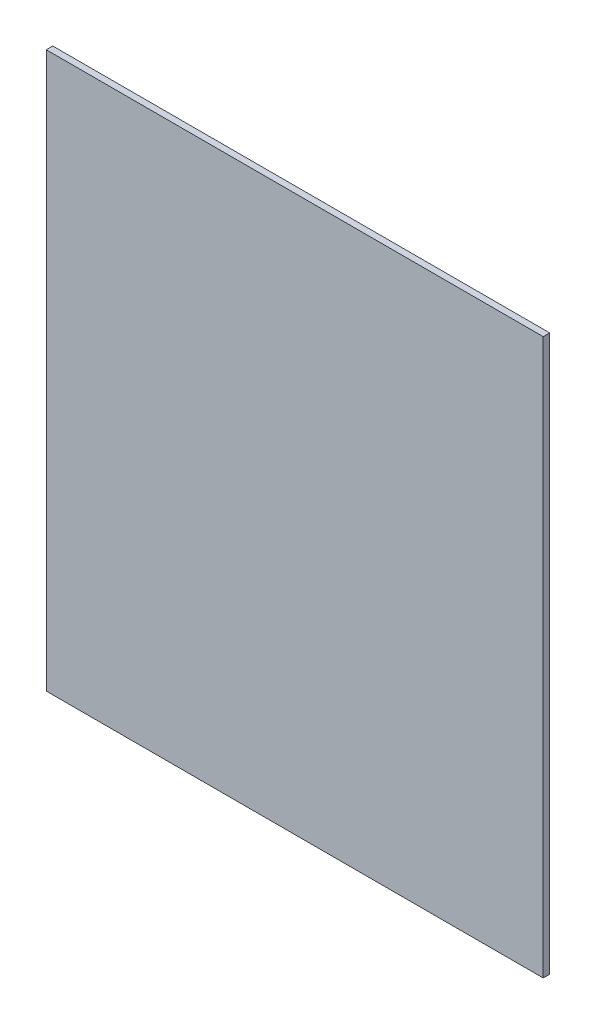
ISO-10303-21;
HEADER;
FILE_DESCRIPTION(('STEP AP214'),'2;1');
FILE_NAME('part.step','',(''),(''),'','','');
FILE_SCHEMA(('AUTOMOTIVE_DESIGN { 1 0 10303 214 1 1 1 1 }'));
ENDSEC;
DATA;
#1=APPLICATION_CONTEXT('core data for automotive mechanical design processes');
#2=APPLICATION_PROTOCOL_DEFINITION('international standard','automotive_design',2000,#1);
#3=PRODUCT_CONTEXT('',#1,'mechanical');
#4=PRODUCT('Part','Part','',(#3));
#5=PRODUCT_RELATED_PRODUCT_CATEGORY('part','',(#4));
#6=PRODUCT_DEFINITION_FORMATION('','',#4);
#7=PRODUCT_DEFINITION_CONTEXT('part definition',#1,'design');
#8=PRODUCT_DEFINITION('design','',#6,#7);
#9=PRODUCT_DEFINITION_SHAPE('','',#8);
#10=(LENGTH_UNIT() NAMED_UNIT(*) SI_UNIT(.MILLI.,.METRE.));
#11=(NAMED_UNIT(*) PLANE_ANGLE_UNIT() SI_UNIT($,.RADIAN.));
#12=(NAMED_UNIT(*) SI_UNIT($,.STERADIAN.) SOLID_ANGLE_UNIT());
#13=UNCERTAINTY_MEASURE_WITH_UNIT(LENGTH_MEASURE(1.E-05),#10,'distance_accuracy_value','');
#14=(GEOMETRIC_REPRESENTATION_CONTEXT(3) GLOBAL_UNCERTAINTY_ASSIGNED_CONTEXT((#13)) GLOBAL_UNIT_ASSIGNED_CONTEXT((#10,
#11,#12)) REPRESENTATION_CONTEXT('',''));
#15=CARTESIAN_POINT('',(0.,0.,0.));
#16=DIRECTION('',(0.,0.,1.));
#17=DIRECTION('',(1.,0.,0.));
#18=AXIS2_PLACEMENT_3D('',#15,#16,#17);
#19=CARTESIAN_POINT('',(76.5,-85.5,2.));
#20=DIRECTION('',(-1.,0.,0.));
#21=DIRECTION('',(0.,0.,1.));
#22=AXIS2_PLACEMENT_3D('',#19,#20,#21);
#23=PLANE('',#22);
#24=DIRECTION('',(0.,1.,0.));
#25=VECTOR('',#24,1.);
#26=CARTESIAN_POINT('',(76.5,-85.5,0.));
#27=LINE('',#26,#25);
#28=CARTESIAN_POINT('',(76.5,-85.5,0.));
#29=VERTEX_POINT('',#28);
#30=CARTESIAN_POINT('',(76.5,85.5,0.));
#31=VERTEX_POINT('',#30);
#32=EDGE_CURVE('E96',#29,#31,#27,.T.);
#33=ORIENTED_EDGE('',*,*,#32,.T.);
#34=DIRECTION('',(0.,0.,-1.));
#35=VECTOR('',#34,1.);
#36=CARTESIAN_POINT('',(76.5,85.5,2.));
#37=LINE('',#36,#35);
#38=CARTESIAN_POINT('',(76.5,85.5,2.));
#39=VERTEX_POINT('',#38);
#40=EDGE_CURVE('E11',#39,#31,#37,.T.);
#41=ORIENTED_EDGE('',*,*,#40,.F.);
#42=DIRECTION('',(0.,1.,0.));
#43=VECTOR('',#42,1.);
#44=CARTESIAN_POINT('',(76.5,-85.5,2.));
#45=LINE('',#44,#43);
#46=CARTESIAN_POINT('',(76.5,-85.5,2.));
#47=VERTEX_POINT('',#46);
#48=EDGE_CURVE('E84',#47,#39,#45,.T.);
#49=ORIENTED_EDGE('',*,*,#48,.F.);
#50=DIRECTION('',(0.,0.,-1.));
#51=VECTOR('',#50,1.);
#52=CARTESIAN_POINT('',(76.5,-85.5,2.));
#53=LINE('',#52,#51);
#54=EDGE_CURVE('E92',#47,#29,#53,.T.);
#55=ORIENTED_EDGE('',*,*,#54,.T.);
#56=EDGE_LOOP('',(#33,#41,#49,#55));
#57=FACE_BOUND('',#56,.T.);
#58=ADVANCED_FACE('F33',(#57),#23,.F.);
#59=CARTESIAN_POINT('',(-76.5,85.5,2.));
#60=DIRECTION('',(0.,-1.,0.));
#61=DIRECTION('',(0.,0.,-1.));
#62=AXIS2_PLACEMENT_3D('',#59,#60,#61);
#63=PLANE('',#62);
#64=DIRECTION('',(-1.,0.,0.));
#65=VECTOR('',#64,1.);
#66=CARTESIAN_POINT('',(-76.5,85.5,0.));
#67=LINE('',#66,#65);
#68=CARTESIAN_POINT('',(-76.5,85.5,0.));
#69=VERTEX_POINT('',#68);
#70=EDGE_CURVE('E88',#31,#69,#67,.T.);
#71=ORIENTED_EDGE('',*,*,#70,.T.);
#72=DIRECTION('',(0.,0.,-1.));
#73=VECTOR('',#72,1.);
#74=CARTESIAN_POINT('',(-76.5,85.5,2.));
#75=LINE('',#74,#73);
#76=CARTESIAN_POINT('',(-76.5,85.5,2.));
#77=VERTEX_POINT('',#76);
#78=EDGE_CURVE('E41',#77,#69,#75,.T.);
#79=ORIENTED_EDGE('',*,*,#78,.F.);
#80=DIRECTION('',(-1.,0.,0.));
#81=VECTOR('',#80,1.);
#82=CARTESIAN_POINT('',(-76.5,85.5,2.));
#83=LINE('',#82,#81);
#84=EDGE_CURVE('E79',#39,#77,#83,.T.);
#85=ORIENTED_EDGE('',*,*,#84,.F.);
#86=ORIENTED_EDGE('',*,*,#40,.T.);
#87=EDGE_LOOP('',(#71,#79,#85,#86));
#88=FACE_BOUND('',#87,.T.);
#89=ADVANCED_FACE('F87',(#88),#63,.F.);
#90=CARTESIAN_POINT('',(-76.5,-85.5,2.));
#91=DIRECTION('',(1.,0.,0.));
#92=DIRECTION('',(0.,0.,-1.));
#93=AXIS2_PLACEMENT_3D('',#90,#91,#92);
#94=PLANE('',#93);
#95=DIRECTION('',(0.,-1.,0.));
#96=VECTOR('',#95,1.);
#97=CARTESIAN_POINT('',(-76.5,-85.5,0.));
#98=LINE('',#97,#96);
#99=CARTESIAN_POINT('',(-76.5,-85.5,0.));
#100=VERTEX_POINT('',#99);
#101=EDGE_CURVE('E66',#69,#100,#98,.T.);
#102=ORIENTED_EDGE('',*,*,#101,.T.);
#103=DIRECTION('',(0.,0.,-1.));
#104=VECTOR('',#103,1.);
#105=CARTESIAN_POINT('',(-76.5,-85.5,2.));
#106=LINE('',#105,#104);
#107=CARTESIAN_POINT('',(-76.5,-85.5,2.));
#108=VERTEX_POINT('',#107);
#109=EDGE_CURVE('E89',#108,#100,#106,.T.);
#110=ORIENTED_EDGE('',*,*,#109,.F.);
#111=DIRECTION('',(0.,-1.,0.));
#112=VECTOR('',#111,1.);
#113=CARTESIAN_POINT('',(-76.5,-85.5,2.));
#114=LINE('',#113,#112);
#115=EDGE_CURVE('E82',#77,#108,#114,.T.);
#116=ORIENTED_EDGE('',*,*,#115,.F.);
#117=ORIENTED_EDGE('',*,*,#78,.T.);
#118=EDGE_LOOP('',(#102,#110,#116,#117));
#119=FACE_BOUND('',#118,.T.);
#120=ADVANCED_FACE('F90',(#119),#94,.F.);
#121=CARTESIAN_POINT('',(-76.5,-85.5,2.));
#122=DIRECTION('',(0.,1.,0.));
#123=DIRECTION('',(0.,0.,1.));
#124=AXIS2_PLACEMENT_3D('',#121,#122,#123);
#125=PLANE('',#124);
#126=DIRECTION('',(1.,0.,0.));
#127=VECTOR('',#126,1.);
#128=CARTESIAN_POINT('',(-76.5,-85.5,0.));
#129=LINE('',#128,#127);
#130=EDGE_CURVE('E72',#100,#29,#129,.T.);
#131=ORIENTED_EDGE('',*,*,#130,.T.);
#132=ORIENTED_EDGE('',*,*,#54,.F.);
#133=DIRECTION('',(1.,0.,0.));
#134=VECTOR('',#133,1.);
#135=CARTESIAN_POINT('',(-76.5,-85.5,2.));
#136=LINE('',#135,#134);
#137=EDGE_CURVE('E49',#108,#47,#136,.T.);
#138=ORIENTED_EDGE('',*,*,#137,.F.);
#139=ORIENTED_EDGE('',*,*,#109,.T.);
#140=EDGE_LOOP('',(#131,#132,#138,#139));
#141=FACE_BOUND('',#140,.T.);
#142=ADVANCED_FACE('F103',(#141),#125,.F.);
#143=CARTESIAN_POINT('',(0.,0.,2.));
#144=DIRECTION('',(0.,0.,-1.));
#145=DIRECTION('',(-1.,0.,0.));
#146=AXIS2_PLACEMENT_3D('',#143,#144,#145);
#147=PLANE('',#146);
#148=ORIENTED_EDGE('',*,*,#48,.T.);
#149=ORIENTED_EDGE('',*,*,#84,.T.);
#150=ORIENTED_EDGE('',*,*,#115,.T.);
#151=ORIENTED_EDGE('',*,*,#137,.T.);
#152=EDGE_LOOP('',(#148,#149,#150,#151));
#153=FACE_BOUND('',#152,.T.);
#154=ADVANCED_FACE('F80',(#153),#147,.F.);
#155=CARTESIAN_POINT('',(0.,0.,0.));
#156=DIRECTION('',(0.,0.,-1.));
#157=DIRECTION('',(-1.,0.,0.));
#158=AXIS2_PLACEMENT_3D('',#155,#156,#157);
#159=PLANE('',#158);
#160=ORIENTED_EDGE('',*,*,#32,.F.);
#161=ORIENTED_EDGE('',*,*,#130,.F.);
#162=ORIENTED_EDGE('',*,*,#101,.F.);
#163=ORIENTED_EDGE('',*,*,#70,.F.);
#164=EDGE_LOOP('',(#160,#161,#162,#163));
#165=FACE_BOUND('',#164,.T.);
#166=ADVANCED_FACE('F106',(#165),#159,.T.);
#167=CLOSED_SHELL('',(#58,#89,#120,#142,#154,#166));
#168=MANIFOLD_SOLID_BREP('B2',#167);
#169=ADVANCED_BREP_SHAPE_REPRESENTATION('',(#18,#168),#14);
#170=SHAPE_DEFINITION_REPRESENTATION(#9,#169);
ENDSEC;
END-ISO-10303-21;
